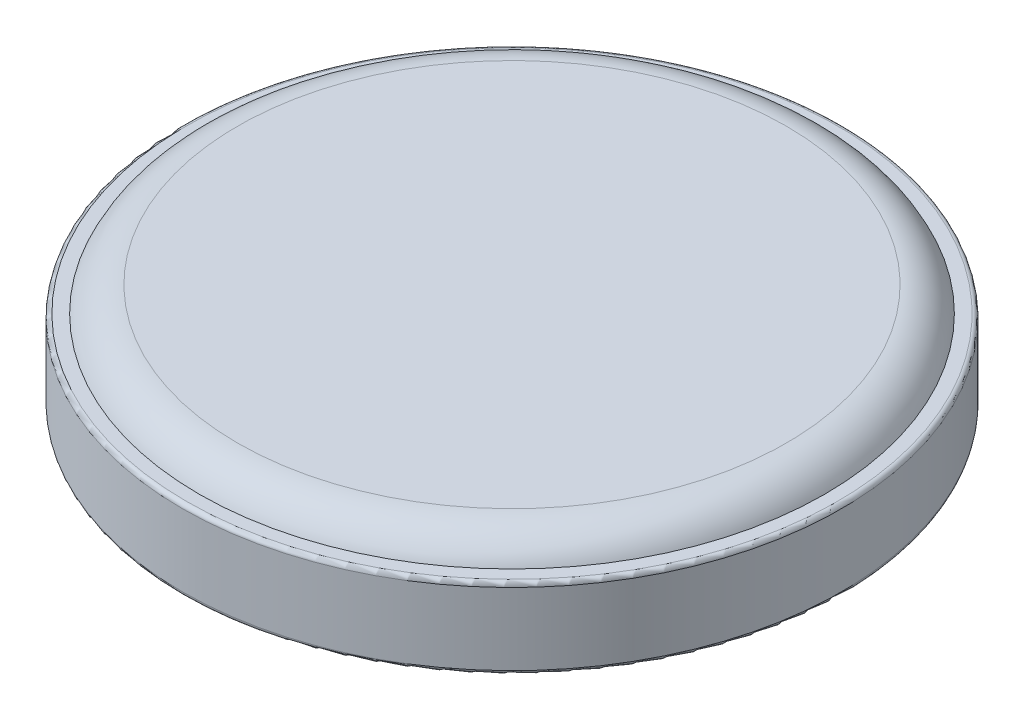
ISO-10303-21;
HEADER;
FILE_DESCRIPTION(('STEP AP214'),'2;1');
FILE_NAME('part.step','',(''),(''),'','','');
FILE_SCHEMA(('AUTOMOTIVE_DESIGN { 1 0 10303 214 1 1 1 1 }'));
ENDSEC;
DATA;
#1=APPLICATION_CONTEXT('core data for automotive mechanical design processes');
#2=APPLICATION_PROTOCOL_DEFINITION('international standard','automotive_design',2000,#1);
#3=PRODUCT_CONTEXT('',#1,'mechanical');
#4=PRODUCT('Part','Part','',(#3));
#5=PRODUCT_RELATED_PRODUCT_CATEGORY('part','',(#4));
#6=PRODUCT_DEFINITION_FORMATION('','',#4);
#7=PRODUCT_DEFINITION_CONTEXT('part definition',#1,'design');
#8=PRODUCT_DEFINITION('design','',#6,#7);
#9=PRODUCT_DEFINITION_SHAPE('','',#8);
#10=(LENGTH_UNIT() NAMED_UNIT(*) SI_UNIT(.MILLI.,.METRE.));
#11=(NAMED_UNIT(*) PLANE_ANGLE_UNIT() SI_UNIT($,.RADIAN.));
#12=(NAMED_UNIT(*) SI_UNIT($,.STERADIAN.) SOLID_ANGLE_UNIT());
#13=UNCERTAINTY_MEASURE_WITH_UNIT(LENGTH_MEASURE(1.E-05),#10,'distance_accuracy_value','');
#14=(GEOMETRIC_REPRESENTATION_CONTEXT(3) GLOBAL_UNCERTAINTY_ASSIGNED_CONTEXT((#13)) GLOBAL_UNIT_ASSIGNED_CONTEXT((#10,
#11,#12)) REPRESENTATION_CONTEXT('',''));
#15=CARTESIAN_POINT('',(0.,0.,0.));
#16=DIRECTION('',(0.,0.,1.));
#17=DIRECTION('',(1.,0.,0.));
#18=AXIS2_PLACEMENT_3D('',#15,#16,#17);
#19=CARTESIAN_POINT('',(0.,3.2,0.));
#20=DIRECTION('',(0.,-1.,0.));
#21=DIRECTION('',(0.,0.,-1.));
#22=AXIS2_PLACEMENT_3D('',#19,#20,#21);
#23=CYLINDRICAL_SURFACE('',#22,10.);
#24=CARTESIAN_POINT('',(0.,0.127,0.));
#25=DIRECTION('',(0.,1.,0.));
#26=DIRECTION('',(0.,0.,1.));
#27=AXIS2_PLACEMENT_3D('',#24,#25,#26);
#28=CIRCLE('',#27,10.);
#29=CARTESIAN_POINT('',(0.,0.127,10.));
#30=VERTEX_POINT('',#29);
#31=EDGE_CURVE('E48',#30,#30,#28,.T.);
#32=ORIENTED_EDGE('',*,*,#31,.T.);
#33=EDGE_LOOP('',(#32));
#34=FACE_BOUND('',#33,.T.);
#35=CARTESIAN_POINT('',(0.,2.311,0.));
#36=DIRECTION('',(0.,1.,0.));
#37=DIRECTION('',(0.,0.,1.));
#38=AXIS2_PLACEMENT_3D('',#35,#36,#37);
#39=CIRCLE('',#38,10.);
#40=CARTESIAN_POINT('',(0.,2.311,10.));
#41=VERTEX_POINT('',#40);
#42=EDGE_CURVE('E52',#41,#41,#39,.F.);
#43=ORIENTED_EDGE('',*,*,#42,.T.);
#44=EDGE_LOOP('',(#43));
#45=FACE_BOUND('',#44,.T.);
#46=ADVANCED_FACE('F37',(#34,#45),#23,.T.);
#47=CARTESIAN_POINT('',(0.,0.,0.));
#48=DIRECTION('',(0.,1.,0.));
#49=DIRECTION('',(0.,0.,1.));
#50=AXIS2_PLACEMENT_3D('',#47,#48,#49);
#51=PLANE('',#50);
#52=CARTESIAN_POINT('',(0.,0.,0.));
#53=DIRECTION('',(0.,1.,0.));
#54=DIRECTION('',(0.,0.,1.));
#55=AXIS2_PLACEMENT_3D('',#52,#53,#54);
#56=CIRCLE('',#55,9.873);
#57=CARTESIAN_POINT('',(0.,0.,9.873));
#58=VERTEX_POINT('',#57);
#59=EDGE_CURVE('E44',#58,#58,#56,.F.);
#60=ORIENTED_EDGE('',*,*,#59,.T.);
#61=EDGE_LOOP('',(#60));
#62=FACE_BOUND('',#61,.T.);
#63=ADVANCED_FACE('F70',(#62),#51,.F.);
#64=CARTESIAN_POINT('',(0.,2.438,0.));
#65=DIRECTION('',(0.,1.,0.));
#66=DIRECTION('',(0.,0.,1.));
#67=AXIS2_PLACEMENT_3D('',#64,#65,#66);
#68=PLANE('',#67);
#69=CARTESIAN_POINT('',(0.,2.438,0.));
#70=DIRECTION('',(0.,1.,0.));
#71=DIRECTION('',(0.,0.,1.));
#72=AXIS2_PLACEMENT_3D('',#69,#70,#71);
#73=CIRCLE('',#72,9.873);
#74=CARTESIAN_POINT('',(0.,2.438,9.873));
#75=VERTEX_POINT('',#74);
#76=EDGE_CURVE('E10',#75,#75,#73,.T.);
#77=ORIENTED_EDGE('',*,*,#76,.T.);
#78=EDGE_LOOP('',(#77));
#79=FACE_BOUND('',#78,.T.);
#80=CARTESIAN_POINT('',(0.,2.438,0.));
#81=DIRECTION('',(0.,1.,0.));
#82=DIRECTION('',(0.,0.,1.));
#83=AXIS2_PLACEMENT_3D('',#80,#81,#82);
#84=CIRCLE('',#83,9.492);
#85=CARTESIAN_POINT('',(0.,2.438,9.492));
#86=VERTEX_POINT('',#85);
#87=EDGE_CURVE('E60',#86,#86,#84,.T.);
#88=ORIENTED_EDGE('',*,*,#87,.F.);
#89=EDGE_LOOP('',(#88));
#90=FACE_BOUND('',#89,.T.);
#91=ADVANCED_FACE('F67',(#79,#90),#68,.T.);
#92=CARTESIAN_POINT('',(0.,3.2,0.));
#93=DIRECTION('',(0.,1.,0.));
#94=DIRECTION('',(0.,0.,1.));
#95=AXIS2_PLACEMENT_3D('',#92,#93,#94);
#96=PLANE('',#95);
#97=CARTESIAN_POINT('',(0.,3.2,0.));
#98=DIRECTION('',(0.,1.,0.));
#99=DIRECTION('',(0.,0.,1.));
#100=AXIS2_PLACEMENT_3D('',#97,#98,#99);
#101=CIRCLE('',#100,8.32802577348122);
#102=CARTESIAN_POINT('',(0.,3.2,8.32802577348122));
#103=VERTEX_POINT('',#102);
#104=EDGE_CURVE('E57',#103,#103,#101,.T.);
#105=ORIENTED_EDGE('',*,*,#104,.T.);
#106=EDGE_LOOP('',(#105));
#107=FACE_BOUND('',#106,.T.);
#108=ADVANCED_FACE('F69',(#107),#96,.T.);
#109=CARTESIAN_POINT('',(0.,1.93,0.));
#110=DIRECTION('',(0.,-1.,0.));
#111=DIRECTION('',(0.,0.,-1.));
#112=AXIS2_PLACEMENT_3D('',#109,#110,#111);
#113=TOROIDAL_SURFACE('',#112,8.32802577348122,1.27);
#114=ORIENTED_EDGE('',*,*,#87,.T.);
#115=EDGE_LOOP('',(#114));
#116=FACE_BOUND('',#115,.T.);
#117=ORIENTED_EDGE('',*,*,#104,.F.);
#118=EDGE_LOOP('',(#117));
#119=FACE_BOUND('',#118,.T.);
#120=ADVANCED_FACE('F64',(#116,#119),#113,.T.);
#121=CARTESIAN_POINT('',(0.,0.127,0.));
#122=DIRECTION('',(0.,1.,0.));
#123=DIRECTION('',(0.,0.,1.));
#124=AXIS2_PLACEMENT_3D('',#121,#122,#123);
#125=TOROIDAL_SURFACE('',#124,9.873,0.127);
#126=ORIENTED_EDGE('',*,*,#59,.F.);
#127=EDGE_LOOP('',(#126));
#128=FACE_BOUND('',#127,.T.);
#129=ORIENTED_EDGE('',*,*,#31,.F.);
#130=EDGE_LOOP('',(#129));
#131=FACE_BOUND('',#130,.T.);
#132=ADVANCED_FACE('F88',(#128,#131),#125,.T.);
#133=CARTESIAN_POINT('',(0.,2.311,0.));
#134=DIRECTION('',(0.,1.,0.));
#135=DIRECTION('',(0.,0.,1.));
#136=AXIS2_PLACEMENT_3D('',#133,#134,#135);
#137=TOROIDAL_SURFACE('',#136,9.873,0.127);
#138=ORIENTED_EDGE('',*,*,#42,.F.);
#139=EDGE_LOOP('',(#138));
#140=FACE_BOUND('',#139,.T.);
#141=ORIENTED_EDGE('',*,*,#76,.F.);
#142=EDGE_LOOP('',(#141));
#143=FACE_BOUND('',#142,.T.);
#144=ADVANCED_FACE('F39',(#140,#143),#137,.T.);
#145=CLOSED_SHELL('',(#46,#63,#91,#108,#120,#132,#144));
#146=MANIFOLD_SOLID_BREP('B2',#145);
#147=ADVANCED_BREP_SHAPE_REPRESENTATION('',(#18,#146),#14);
#148=SHAPE_DEFINITION_REPRESENTATION(#9,#147);
ENDSEC;
END-ISO-10303-21;
